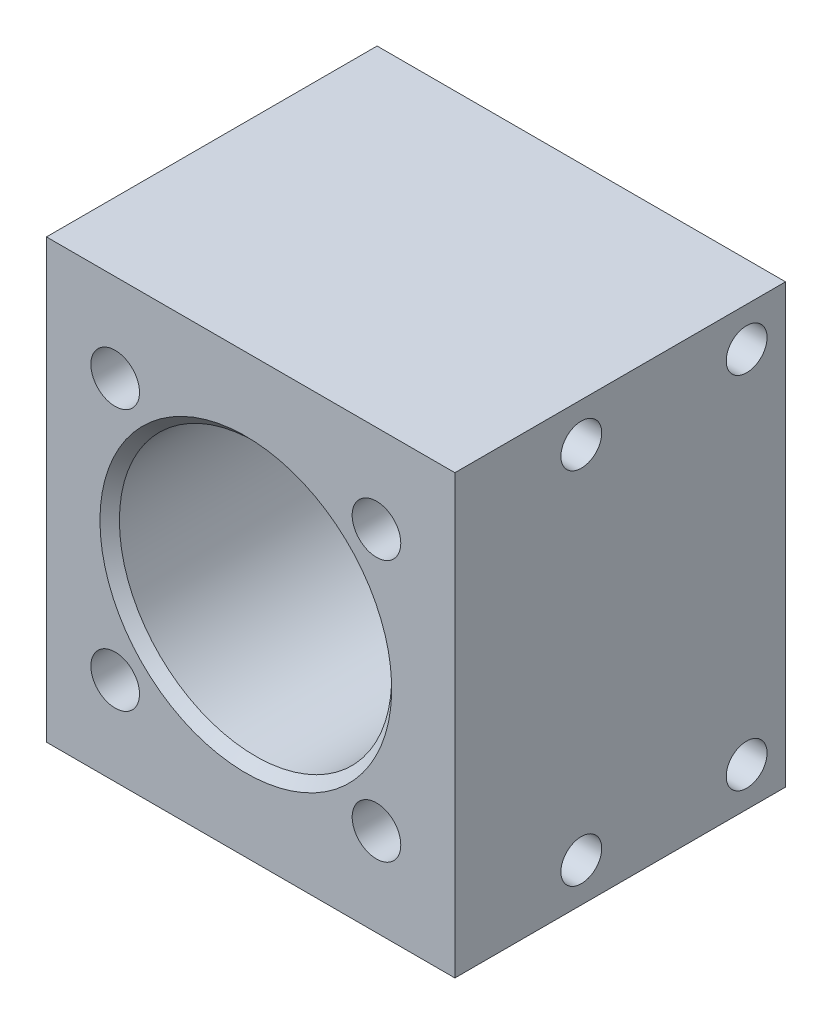
ISO-10303-21;
HEADER;
FILE_DESCRIPTION(('STEP AP214'),'2;1');
FILE_NAME('part.step','',(''),(''),'','','');
FILE_SCHEMA(('AUTOMOTIVE_DESIGN { 1 0 10303 214 1 1 1 1 }'));
ENDSEC;
DATA;
#1=APPLICATION_CONTEXT('core data for automotive mechanical design processes');
#2=APPLICATION_PROTOCOL_DEFINITION('international standard','automotive_design',2000,#1);
#3=PRODUCT_CONTEXT('',#1,'mechanical');
#4=PRODUCT('Part','Part','',(#3));
#5=PRODUCT_RELATED_PRODUCT_CATEGORY('part','',(#4));
#6=PRODUCT_DEFINITION_FORMATION('','',#4);
#7=PRODUCT_DEFINITION_CONTEXT('part definition',#1,'design');
#8=PRODUCT_DEFINITION('design','',#6,#7);
#9=PRODUCT_DEFINITION_SHAPE('','',#8);
#10=(LENGTH_UNIT() NAMED_UNIT(*) SI_UNIT(.MILLI.,.METRE.));
#11=(NAMED_UNIT(*) PLANE_ANGLE_UNIT() SI_UNIT($,.RADIAN.));
#12=(NAMED_UNIT(*) SI_UNIT($,.STERADIAN.) SOLID_ANGLE_UNIT());
#13=UNCERTAINTY_MEASURE_WITH_UNIT(LENGTH_MEASURE(1.E-05),#10,'distance_accuracy_value','');
#14=(GEOMETRIC_REPRESENTATION_CONTEXT(3) GLOBAL_UNCERTAINTY_ASSIGNED_CONTEXT((#13)) GLOBAL_UNIT_ASSIGNED_CONTEXT((#10,
#11,#12)) REPRESENTATION_CONTEXT('',''));
#15=CARTESIAN_POINT('',(0.,0.,0.));
#16=DIRECTION('',(0.,0.,1.));
#17=DIRECTION('',(1.,0.,0.));
#18=AXIS2_PLACEMENT_3D('',#15,#16,#17);
#19=CARTESIAN_POINT('',(0.,0.,34.));
#20=DIRECTION('',(0.,0.,-1.));
#21=DIRECTION('',(-1.,0.,0.));
#22=AXIS2_PLACEMENT_3D('',#19,#20,#21);
#23=PLANE('',#22);
#24=CARTESIAN_POINT('',(33.9350288425444,35.9350288425444,34.));
#25=DIRECTION('',(0.,0.,1.));
#26=DIRECTION('',(1.,0.,0.));
#27=AXIS2_PLACEMENT_3D('',#24,#25,#26);
#28=CIRCLE('',#27,2.5);
#29=CARTESIAN_POINT('',(36.4350288425444,35.9350288425444,34.));
#30=VERTEX_POINT('',#29);
#31=EDGE_CURVE('E139',#30,#30,#28,.T.);
#32=ORIENTED_EDGE('',*,*,#31,.F.);
#33=EDGE_LOOP('',(#32));
#34=FACE_BOUND('',#33,.T.);
#35=CARTESIAN_POINT('',(7.06497115745553,35.9350288425444,34.));
#36=DIRECTION('',(0.,0.,1.));
#37=DIRECTION('',(1.,0.,0.));
#38=AXIS2_PLACEMENT_3D('',#35,#36,#37);
#39=CIRCLE('',#38,2.5);
#40=CARTESIAN_POINT('',(9.56497115745553,35.9350288425444,34.));
#41=VERTEX_POINT('',#40);
#42=EDGE_CURVE('E145',#41,#41,#39,.T.);
#43=ORIENTED_EDGE('',*,*,#42,.F.);
#44=EDGE_LOOP('',(#43));
#45=FACE_BOUND('',#44,.T.);
#46=CARTESIAN_POINT('',(7.06497115745553,9.06497115745563,34.));
#47=DIRECTION('',(0.,0.,1.));
#48=DIRECTION('',(1.,0.,0.));
#49=AXIS2_PLACEMENT_3D('',#46,#47,#48);
#50=CIRCLE('',#49,2.5);
#51=CARTESIAN_POINT('',(9.56497115745553,9.06497115745563,34.));
#52=VERTEX_POINT('',#51);
#53=EDGE_CURVE('E151',#52,#52,#50,.T.);
#54=ORIENTED_EDGE('',*,*,#53,.F.);
#55=EDGE_LOOP('',(#54));
#56=FACE_BOUND('',#55,.T.);
#57=CARTESIAN_POINT('',(33.9350288425444,9.06497115745563,34.));
#58=DIRECTION('',(0.,0.,1.));
#59=DIRECTION('',(1.,0.,0.));
#60=AXIS2_PLACEMENT_3D('',#57,#58,#59);
#61=CIRCLE('',#60,2.5);
#62=CARTESIAN_POINT('',(36.4350288425444,9.06497115745563,34.));
#63=VERTEX_POINT('',#62);
#64=EDGE_CURVE('E157',#63,#63,#61,.T.);
#65=ORIENTED_EDGE('',*,*,#64,.F.);
#66=EDGE_LOOP('',(#65));
#67=FACE_BOUND('',#66,.T.);
#68=CARTESIAN_POINT('',(20.5,22.5,34.));
#69=DIRECTION('',(0.,0.,-1.));
#70=DIRECTION('',(-1.,0.,0.));
#71=AXIS2_PLACEMENT_3D('',#68,#69,#70);
#72=CIRCLE('',#71,15.);
#73=CARTESIAN_POINT('',(5.49999999999996,22.5,34.));
#74=VERTEX_POINT('',#73);
#75=EDGE_CURVE('E11',#74,#74,#72,.T.);
#76=ORIENTED_EDGE('',*,*,#75,.T.);
#77=EDGE_LOOP('',(#76));
#78=FACE_BOUND('',#77,.T.);
#79=DIRECTION('',(0.,-1.,0.));
#80=VECTOR('',#79,1.);
#81=CARTESIAN_POINT('',(0.,0.,34.));
#82=LINE('',#81,#80);
#83=CARTESIAN_POINT('',(0.,45.,34.));
#84=VERTEX_POINT('',#83);
#85=CARTESIAN_POINT('',(0.,0.,34.));
#86=VERTEX_POINT('',#85);
#87=EDGE_CURVE('E164',#84,#86,#82,.T.);
#88=ORIENTED_EDGE('',*,*,#87,.T.);
#89=DIRECTION('',(1.,0.,0.));
#90=VECTOR('',#89,1.);
#91=CARTESIAN_POINT('',(0.,0.,34.));
#92=LINE('',#91,#90);
#93=CARTESIAN_POINT('',(42.,0.,34.));
#94=VERTEX_POINT('',#93);
#95=EDGE_CURVE('E81',#86,#94,#92,.T.);
#96=ORIENTED_EDGE('',*,*,#95,.T.);
#97=DIRECTION('',(0.,1.,0.));
#98=VECTOR('',#97,1.);
#99=CARTESIAN_POINT('',(42.,0.,34.));
#100=LINE('',#99,#98);
#101=CARTESIAN_POINT('',(42.,45.,34.));
#102=VERTEX_POINT('',#101);
#103=EDGE_CURVE('E167',#94,#102,#100,.T.);
#104=ORIENTED_EDGE('',*,*,#103,.T.);
#105=DIRECTION('',(-1.,0.,0.));
#106=VECTOR('',#105,1.);
#107=CARTESIAN_POINT('',(0.,45.,34.));
#108=LINE('',#107,#106);
#109=EDGE_CURVE('E49',#102,#84,#108,.T.);
#110=ORIENTED_EDGE('',*,*,#109,.T.);
#111=EDGE_LOOP('',(#88,#96,#104,#110));
#112=FACE_BOUND('',#111,.T.);
#113=ADVANCED_FACE('F32',(#34,#45,#56,#67,#78,#112),#23,.F.);
#114=CARTESIAN_POINT('',(0.,0.,0.));
#115=DIRECTION('',(0.,0.,-1.));
#116=DIRECTION('',(-1.,0.,0.));
#117=AXIS2_PLACEMENT_3D('',#114,#115,#116);
#118=PLANE('',#117);
#119=CARTESIAN_POINT('',(20.5,22.5,0.));
#120=DIRECTION('',(0.,0.,-1.));
#121=DIRECTION('',(-1.,0.,0.));
#122=AXIS2_PLACEMENT_3D('',#119,#120,#121);
#123=CIRCLE('',#122,15.);
#124=CARTESIAN_POINT('',(5.49999999999998,22.5,0.));
#125=VERTEX_POINT('',#124);
#126=EDGE_CURVE('E184',#125,#125,#123,.F.);
#127=ORIENTED_EDGE('',*,*,#126,.T.);
#128=EDGE_LOOP('',(#127));
#129=FACE_BOUND('',#128,.T.);
#130=DIRECTION('',(0.,-1.,0.));
#131=VECTOR('',#130,1.);
#132=CARTESIAN_POINT('',(0.,0.,0.));
#133=LINE('',#132,#131);
#134=CARTESIAN_POINT('',(0.,45.,0.));
#135=VERTEX_POINT('',#134);
#136=CARTESIAN_POINT('',(0.,0.,0.));
#137=VERTEX_POINT('',#136);
#138=EDGE_CURVE('E163',#135,#137,#133,.T.);
#139=ORIENTED_EDGE('',*,*,#138,.F.);
#140=DIRECTION('',(-1.,0.,0.));
#141=VECTOR('',#140,1.);
#142=CARTESIAN_POINT('',(0.,45.,0.));
#143=LINE('',#142,#141);
#144=CARTESIAN_POINT('',(42.,45.,0.));
#145=VERTEX_POINT('',#144);
#146=EDGE_CURVE('E73',#145,#135,#143,.T.);
#147=ORIENTED_EDGE('',*,*,#146,.F.);
#148=DIRECTION('',(0.,1.,0.));
#149=VECTOR('',#148,1.);
#150=CARTESIAN_POINT('',(42.,0.,0.));
#151=LINE('',#150,#149);
#152=CARTESIAN_POINT('',(42.,0.,0.));
#153=VERTEX_POINT('',#152);
#154=EDGE_CURVE('E67',#153,#145,#151,.T.);
#155=ORIENTED_EDGE('',*,*,#154,.F.);
#156=DIRECTION('',(1.,0.,0.));
#157=VECTOR('',#156,1.);
#158=CARTESIAN_POINT('',(0.,0.,0.));
#159=LINE('',#158,#157);
#160=EDGE_CURVE('E173',#137,#153,#159,.T.);
#161=ORIENTED_EDGE('',*,*,#160,.F.);
#162=EDGE_LOOP('',(#139,#147,#155,#161));
#163=FACE_BOUND('',#162,.T.);
#164=ADVANCED_FACE('F200',(#129,#163),#118,.T.);
#165=CARTESIAN_POINT('',(0.,0.,34.));
#166=DIRECTION('',(1.,0.,0.));
#167=DIRECTION('',(0.,1.,0.));
#168=AXIS2_PLACEMENT_3D('',#165,#166,#167);
#169=PLANE('',#168);
#170=ORIENTED_EDGE('',*,*,#138,.T.);
#171=DIRECTION('',(0.,0.,-1.));
#172=VECTOR('',#171,1.);
#173=CARTESIAN_POINT('',(0.,0.,34.));
#174=LINE('',#173,#172);
#175=EDGE_CURVE('E182',#86,#137,#174,.T.);
#176=ORIENTED_EDGE('',*,*,#175,.F.);
#177=ORIENTED_EDGE('',*,*,#87,.F.);
#178=DIRECTION('',(0.,0.,-1.));
#179=VECTOR('',#178,1.);
#180=CARTESIAN_POINT('',(0.,45.,34.));
#181=LINE('',#180,#179);
#182=EDGE_CURVE('E170',#84,#135,#181,.T.);
#183=ORIENTED_EDGE('',*,*,#182,.T.);
#184=EDGE_LOOP('',(#170,#176,#177,#183));
#185=FACE_BOUND('',#184,.T.);
#186=ADVANCED_FACE('F203',(#185),#169,.F.);
#187=CARTESIAN_POINT('',(0.,0.,34.));
#188=DIRECTION('',(0.,1.,0.));
#189=DIRECTION('',(0.,0.,1.));
#190=AXIS2_PLACEMENT_3D('',#187,#188,#189);
#191=PLANE('',#190);
#192=ORIENTED_EDGE('',*,*,#160,.T.);
#193=DIRECTION('',(0.,0.,-1.));
#194=VECTOR('',#193,1.);
#195=CARTESIAN_POINT('',(42.,0.,34.));
#196=LINE('',#195,#194);
#197=EDGE_CURVE('E180',#94,#153,#196,.T.);
#198=ORIENTED_EDGE('',*,*,#197,.F.);
#199=ORIENTED_EDGE('',*,*,#95,.F.);
#200=ORIENTED_EDGE('',*,*,#175,.T.);
#201=EDGE_LOOP('',(#192,#198,#199,#200));
#202=FACE_BOUND('',#201,.T.);
#203=ADVANCED_FACE('F212',(#202),#191,.F.);
#204=CARTESIAN_POINT('',(42.,0.,34.));
#205=DIRECTION('',(-1.,0.,0.));
#206=DIRECTION('',(0.,-1.,0.));
#207=AXIS2_PLACEMENT_3D('',#204,#205,#206);
#208=PLANE('',#207);
#209=CARTESIAN_POINT('',(42.,41.,21.));
#210=DIRECTION('',(1.,0.,0.));
#211=DIRECTION('',(0.,0.,-1.));
#212=AXIS2_PLACEMENT_3D('',#209,#210,#211);
#213=CIRCLE('',#212,2.1);
#214=CARTESIAN_POINT('',(42.,41.,18.9));
#215=VERTEX_POINT('',#214);
#216=EDGE_CURVE('E117',#215,#215,#213,.T.);
#217=ORIENTED_EDGE('',*,*,#216,.F.);
#218=EDGE_LOOP('',(#217));
#219=FACE_BOUND('',#218,.T.);
#220=CARTESIAN_POINT('',(42.,41.,4.));
#221=DIRECTION('',(1.,0.,0.));
#222=DIRECTION('',(0.,0.,-1.));
#223=AXIS2_PLACEMENT_3D('',#220,#221,#222);
#224=CIRCLE('',#223,2.1);
#225=CARTESIAN_POINT('',(42.,41.,1.9));
#226=VERTEX_POINT('',#225);
#227=EDGE_CURVE('E116',#226,#226,#224,.T.);
#228=ORIENTED_EDGE('',*,*,#227,.F.);
#229=EDGE_LOOP('',(#228));
#230=FACE_BOUND('',#229,.T.);
#231=CARTESIAN_POINT('',(42.,3.99999999999999,4.));
#232=DIRECTION('',(1.,0.,0.));
#233=DIRECTION('',(0.,0.,-1.));
#234=AXIS2_PLACEMENT_3D('',#231,#232,#233);
#235=CIRCLE('',#234,2.1);
#236=CARTESIAN_POINT('',(42.,3.99999999999999,1.9));
#237=VERTEX_POINT('',#236);
#238=EDGE_CURVE('E127',#237,#237,#235,.T.);
#239=ORIENTED_EDGE('',*,*,#238,.F.);
#240=EDGE_LOOP('',(#239));
#241=FACE_BOUND('',#240,.T.);
#242=CARTESIAN_POINT('',(42.,4.,21.));
#243=DIRECTION('',(1.,0.,0.));
#244=DIRECTION('',(0.,0.,-1.));
#245=AXIS2_PLACEMENT_3D('',#242,#243,#244);
#246=CIRCLE('',#245,2.1);
#247=CARTESIAN_POINT('',(42.,4.,18.9));
#248=VERTEX_POINT('',#247);
#249=EDGE_CURVE('E133',#248,#248,#246,.T.);
#250=ORIENTED_EDGE('',*,*,#249,.F.);
#251=EDGE_LOOP('',(#250));
#252=FACE_BOUND('',#251,.T.);
#253=ORIENTED_EDGE('',*,*,#154,.T.);
#254=DIRECTION('',(0.,0.,-1.));
#255=VECTOR('',#254,1.);
#256=CARTESIAN_POINT('',(42.,45.,34.));
#257=LINE('',#256,#255);
#258=EDGE_CURVE('E178',#102,#145,#257,.T.);
#259=ORIENTED_EDGE('',*,*,#258,.F.);
#260=ORIENTED_EDGE('',*,*,#103,.F.);
#261=ORIENTED_EDGE('',*,*,#197,.T.);
#262=EDGE_LOOP('',(#253,#259,#260,#261));
#263=FACE_BOUND('',#262,.T.);
#264=ADVANCED_FACE('F211',(#219,#230,#241,#252,#263),#208,.F.);
#265=CARTESIAN_POINT('',(0.,45.,34.));
#266=DIRECTION('',(0.,-1.,0.));
#267=DIRECTION('',(1.,0.,0.));
#268=AXIS2_PLACEMENT_3D('',#265,#266,#267);
#269=PLANE('',#268);
#270=ORIENTED_EDGE('',*,*,#146,.T.);
#271=ORIENTED_EDGE('',*,*,#182,.F.);
#272=ORIENTED_EDGE('',*,*,#109,.F.);
#273=ORIENTED_EDGE('',*,*,#258,.T.);
#274=EDGE_LOOP('',(#270,#271,#272,#273));
#275=FACE_BOUND('',#274,.T.);
#276=ADVANCED_FACE('F209',(#275),#269,.F.);
#277=CARTESIAN_POINT('',(20.5,22.5,34.));
#278=DIRECTION('',(0.,0.,-1.));
#279=DIRECTION('',(-1.,0.,0.));
#280=AXIS2_PLACEMENT_3D('',#277,#278,#279);
#281=CYLINDRICAL_SURFACE('',#280,14.);
#282=CARTESIAN_POINT('',(20.5,22.5,0.999999999999994));
#283=DIRECTION('',(0.,0.,-1.));
#284=DIRECTION('',(-1.,0.,0.));
#285=AXIS2_PLACEMENT_3D('',#282,#283,#284);
#286=CIRCLE('',#285,14.);
#287=CARTESIAN_POINT('',(6.49999999999998,22.5,0.999999999999994));
#288=VERTEX_POINT('',#287);
#289=EDGE_CURVE('E41',#288,#288,#286,.T.);
#290=ORIENTED_EDGE('',*,*,#289,.T.);
#291=EDGE_LOOP('',(#290));
#292=FACE_BOUND('',#291,.T.);
#293=CARTESIAN_POINT('',(20.5,22.5,33.));
#294=DIRECTION('',(0.,0.,-1.));
#295=DIRECTION('',(-1.,0.,0.));
#296=AXIS2_PLACEMENT_3D('',#293,#294,#295);
#297=CIRCLE('',#296,14.);
#298=CARTESIAN_POINT('',(6.49999999999998,22.5,33.));
#299=VERTEX_POINT('',#298);
#300=EDGE_CURVE('E187',#299,#299,#297,.F.);
#301=ORIENTED_EDGE('',*,*,#300,.T.);
#302=EDGE_LOOP('',(#301));
#303=FACE_BOUND('',#302,.T.);
#304=ADVANCED_FACE('F192',(#292,#303),#281,.F.);
#305=CARTESIAN_POINT('',(20.5,22.5,0.));
#306=DIRECTION('',(0.,0.,-1.));
#307=DIRECTION('',(-1.,0.,0.));
#308=AXIS2_PLACEMENT_3D('',#305,#306,#307);
#309=CONICAL_SURFACE('',#308,15.,0.785398163397449);
#310=ORIENTED_EDGE('',*,*,#289,.F.);
#311=EDGE_LOOP('',(#310));
#312=FACE_BOUND('',#311,.T.);
#313=ORIENTED_EDGE('',*,*,#126,.F.);
#314=EDGE_LOOP('',(#313));
#315=FACE_BOUND('',#314,.T.);
#316=ADVANCED_FACE('F195',(#312,#315),#309,.F.);
#317=CARTESIAN_POINT('',(20.5,22.5,33.));
#318=DIRECTION('',(0.,0.,1.));
#319=DIRECTION('',(1.,0.,0.));
#320=AXIS2_PLACEMENT_3D('',#317,#318,#319);
#321=CONICAL_SURFACE('',#320,14.,0.78539816339746);
#322=ORIENTED_EDGE('',*,*,#75,.F.);
#323=EDGE_LOOP('',(#322));
#324=FACE_BOUND('',#323,.T.);
#325=ORIENTED_EDGE('',*,*,#300,.F.);
#326=EDGE_LOOP('',(#325));
#327=FACE_BOUND('',#326,.T.);
#328=ADVANCED_FACE('F34',(#324,#327),#321,.F.);
#329=CARTESIAN_POINT('',(33.9350288425444,9.06497115745563,17.));
#330=DIRECTION('',(0.,0.,1.));
#331=DIRECTION('',(1.,0.,0.));
#332=AXIS2_PLACEMENT_3D('',#329,#330,#331);
#333=CONICAL_SURFACE('',#332,2.5,1.02974425867665);
#334=CARTESIAN_POINT('',(33.9350288425444,9.06497115745563,15.4978484524311));
#335=VERTEX_POINT('',#334);
#336=VERTEX_LOOP('',#335);
#337=FACE_BOUND('',#336,.T.);
#338=CARTESIAN_POINT('',(33.9350288425444,9.06497115745563,17.));
#339=DIRECTION('',(0.,0.,1.));
#340=DIRECTION('',(1.,0.,0.));
#341=AXIS2_PLACEMENT_3D('',#338,#339,#340);
#342=CIRCLE('',#341,2.5);
#343=CARTESIAN_POINT('',(36.4350288425444,9.06497115745563,17.));
#344=VERTEX_POINT('',#343);
#345=EDGE_CURVE('E160',#344,#344,#342,.T.);
#346=ORIENTED_EDGE('',*,*,#345,.T.);
#347=EDGE_LOOP('',(#346));
#348=FACE_BOUND('',#347,.T.);
#349=ADVANCED_FACE('F249',(#337,#348),#333,.F.);
#350=CARTESIAN_POINT('',(33.9350288425444,9.06497115745563,34.));
#351=DIRECTION('',(0.,0.,1.));
#352=DIRECTION('',(1.,0.,0.));
#353=AXIS2_PLACEMENT_3D('',#350,#351,#352);
#354=CYLINDRICAL_SURFACE('',#353,2.5);
#355=ORIENTED_EDGE('',*,*,#345,.F.);
#356=EDGE_LOOP('',(#355));
#357=FACE_BOUND('',#356,.T.);
#358=ORIENTED_EDGE('',*,*,#64,.T.);
#359=EDGE_LOOP('',(#358));
#360=FACE_BOUND('',#359,.T.);
#361=ADVANCED_FACE('F256',(#357,#360),#354,.F.);
#362=CARTESIAN_POINT('',(7.06497115745553,9.06497115745563,17.));
#363=DIRECTION('',(0.,0.,1.));
#364=DIRECTION('',(1.,0.,0.));
#365=AXIS2_PLACEMENT_3D('',#362,#363,#364);
#366=CONICAL_SURFACE('',#365,2.5,1.02974425867665);
#367=CARTESIAN_POINT('',(7.06497115745553,9.06497115745563,15.4978484524311));
#368=VERTEX_POINT('',#367);
#369=VERTEX_LOOP('',#368);
#370=FACE_BOUND('',#369,.T.);
#371=CARTESIAN_POINT('',(7.06497115745553,9.06497115745563,17.));
#372=DIRECTION('',(0.,0.,1.));
#373=DIRECTION('',(1.,0.,0.));
#374=AXIS2_PLACEMENT_3D('',#371,#372,#373);
#375=CIRCLE('',#374,2.5);
#376=CARTESIAN_POINT('',(9.56497115745553,9.06497115745563,17.));
#377=VERTEX_POINT('',#376);
#378=EDGE_CURVE('E154',#377,#377,#375,.T.);
#379=ORIENTED_EDGE('',*,*,#378,.T.);
#380=EDGE_LOOP('',(#379));
#381=FACE_BOUND('',#380,.T.);
#382=ADVANCED_FACE('F263',(#370,#381),#366,.F.);
#383=CARTESIAN_POINT('',(7.06497115745553,9.06497115745563,34.));
#384=DIRECTION('',(0.,0.,1.));
#385=DIRECTION('',(1.,0.,0.));
#386=AXIS2_PLACEMENT_3D('',#383,#384,#385);
#387=CYLINDRICAL_SURFACE('',#386,2.5);
#388=ORIENTED_EDGE('',*,*,#378,.F.);
#389=EDGE_LOOP('',(#388));
#390=FACE_BOUND('',#389,.T.);
#391=ORIENTED_EDGE('',*,*,#53,.T.);
#392=EDGE_LOOP('',(#391));
#393=FACE_BOUND('',#392,.T.);
#394=ADVANCED_FACE('F271',(#390,#393),#387,.F.);
#395=CARTESIAN_POINT('',(7.06497115745553,35.9350288425444,17.));
#396=DIRECTION('',(0.,0.,1.));
#397=DIRECTION('',(1.,0.,0.));
#398=AXIS2_PLACEMENT_3D('',#395,#396,#397);
#399=CONICAL_SURFACE('',#398,2.5,1.02974425867665);
#400=CARTESIAN_POINT('',(7.06497115745553,35.9350288425444,15.4978484524311));
#401=VERTEX_POINT('',#400);
#402=VERTEX_LOOP('',#401);
#403=FACE_BOUND('',#402,.T.);
#404=CARTESIAN_POINT('',(7.06497115745553,35.9350288425444,17.));
#405=DIRECTION('',(0.,0.,1.));
#406=DIRECTION('',(1.,0.,0.));
#407=AXIS2_PLACEMENT_3D('',#404,#405,#406);
#408=CIRCLE('',#407,2.5);
#409=CARTESIAN_POINT('',(9.56497115745553,35.9350288425444,17.));
#410=VERTEX_POINT('',#409);
#411=EDGE_CURVE('E148',#410,#410,#408,.T.);
#412=ORIENTED_EDGE('',*,*,#411,.T.);
#413=EDGE_LOOP('',(#412));
#414=FACE_BOUND('',#413,.T.);
#415=ADVANCED_FACE('F279',(#403,#414),#399,.F.);
#416=CARTESIAN_POINT('',(7.06497115745553,35.9350288425444,34.));
#417=DIRECTION('',(0.,0.,1.));
#418=DIRECTION('',(1.,0.,0.));
#419=AXIS2_PLACEMENT_3D('',#416,#417,#418);
#420=CYLINDRICAL_SURFACE('',#419,2.5);
#421=ORIENTED_EDGE('',*,*,#411,.F.);
#422=EDGE_LOOP('',(#421));
#423=FACE_BOUND('',#422,.T.);
#424=ORIENTED_EDGE('',*,*,#42,.T.);
#425=EDGE_LOOP('',(#424));
#426=FACE_BOUND('',#425,.T.);
#427=ADVANCED_FACE('F287',(#423,#426),#420,.F.);
#428=CARTESIAN_POINT('',(33.9350288425444,35.9350288425444,17.));
#429=DIRECTION('',(0.,0.,1.));
#430=DIRECTION('',(1.,0.,0.));
#431=AXIS2_PLACEMENT_3D('',#428,#429,#430);
#432=CONICAL_SURFACE('',#431,2.5,1.02974425867665);
#433=CARTESIAN_POINT('',(33.9350288425444,35.9350288425444,15.4978484524311));
#434=VERTEX_POINT('',#433);
#435=VERTEX_LOOP('',#434);
#436=FACE_BOUND('',#435,.T.);
#437=CARTESIAN_POINT('',(33.9350288425444,35.9350288425444,17.));
#438=DIRECTION('',(0.,0.,1.));
#439=DIRECTION('',(1.,0.,0.));
#440=AXIS2_PLACEMENT_3D('',#437,#438,#439);
#441=CIRCLE('',#440,2.5);
#442=CARTESIAN_POINT('',(36.4350288425444,35.9350288425444,17.));
#443=VERTEX_POINT('',#442);
#444=EDGE_CURVE('E142',#443,#443,#441,.T.);
#445=ORIENTED_EDGE('',*,*,#444,.T.);
#446=EDGE_LOOP('',(#445));
#447=FACE_BOUND('',#446,.T.);
#448=ADVANCED_FACE('F295',(#436,#447),#432,.F.);
#449=CARTESIAN_POINT('',(33.9350288425444,35.9350288425444,34.));
#450=DIRECTION('',(0.,0.,1.));
#451=DIRECTION('',(1.,0.,0.));
#452=AXIS2_PLACEMENT_3D('',#449,#450,#451);
#453=CYLINDRICAL_SURFACE('',#452,2.5);
#454=ORIENTED_EDGE('',*,*,#444,.F.);
#455=EDGE_LOOP('',(#454));
#456=FACE_BOUND('',#455,.T.);
#457=ORIENTED_EDGE('',*,*,#31,.T.);
#458=EDGE_LOOP('',(#457));
#459=FACE_BOUND('',#458,.T.);
#460=ADVANCED_FACE('F303',(#456,#459),#453,.F.);
#461=CARTESIAN_POINT('',(17.,4.,21.));
#462=DIRECTION('',(1.,0.,0.));
#463=DIRECTION('',(0.,0.,-1.));
#464=AXIS2_PLACEMENT_3D('',#461,#462,#463);
#465=CONICAL_SURFACE('',#464,2.1,1.02974425867665);
#466=CARTESIAN_POINT('',(15.7381927000421,3.99999999999999,21.));
#467=VERTEX_POINT('',#466);
#468=VERTEX_LOOP('',#467);
#469=FACE_BOUND('',#468,.T.);
#470=CARTESIAN_POINT('',(17.,4.,21.));
#471=DIRECTION('',(1.,0.,0.));
#472=DIRECTION('',(0.,0.,-1.));
#473=AXIS2_PLACEMENT_3D('',#470,#471,#472);
#474=CIRCLE('',#473,2.1);
#475=CARTESIAN_POINT('',(17.,4.,18.9));
#476=VERTEX_POINT('',#475);
#477=EDGE_CURVE('E136',#476,#476,#474,.T.);
#478=ORIENTED_EDGE('',*,*,#477,.T.);
#479=EDGE_LOOP('',(#478));
#480=FACE_BOUND('',#479,.T.);
#481=ADVANCED_FACE('F311',(#469,#480),#465,.F.);
#482=CARTESIAN_POINT('',(42.,4.,21.));
#483=DIRECTION('',(1.,0.,0.));
#484=DIRECTION('',(0.,0.,-1.));
#485=AXIS2_PLACEMENT_3D('',#482,#483,#484);
#486=CYLINDRICAL_SURFACE('',#485,2.1);
#487=ORIENTED_EDGE('',*,*,#477,.F.);
#488=EDGE_LOOP('',(#487));
#489=FACE_BOUND('',#488,.T.);
#490=ORIENTED_EDGE('',*,*,#249,.T.);
#491=EDGE_LOOP('',(#490));
#492=FACE_BOUND('',#491,.T.);
#493=ADVANCED_FACE('F320',(#489,#492),#486,.F.);
#494=CARTESIAN_POINT('',(17.,3.99999999999999,4.));
#495=DIRECTION('',(1.,0.,0.));
#496=DIRECTION('',(0.,0.,-1.));
#497=AXIS2_PLACEMENT_3D('',#494,#495,#496);
#498=CONICAL_SURFACE('',#497,2.1,1.02974425867665);
#499=CARTESIAN_POINT('',(15.7381927000421,3.99999999999999,4.));
#500=VERTEX_POINT('',#499);
#501=VERTEX_LOOP('',#500);
#502=FACE_BOUND('',#501,.T.);
#503=CARTESIAN_POINT('',(17.,3.99999999999999,4.));
#504=DIRECTION('',(1.,0.,0.));
#505=DIRECTION('',(0.,0.,-1.));
#506=AXIS2_PLACEMENT_3D('',#503,#504,#505);
#507=CIRCLE('',#506,2.1);
#508=CARTESIAN_POINT('',(17.,3.99999999999999,1.90000000000001));
#509=VERTEX_POINT('',#508);
#510=EDGE_CURVE('E130',#509,#509,#507,.T.);
#511=ORIENTED_EDGE('',*,*,#510,.T.);
#512=EDGE_LOOP('',(#511));
#513=FACE_BOUND('',#512,.T.);
#514=ADVANCED_FACE('F328',(#502,#513),#498,.F.);
#515=CARTESIAN_POINT('',(42.,3.99999999999999,4.));
#516=DIRECTION('',(1.,0.,0.));
#517=DIRECTION('',(0.,0.,-1.));
#518=AXIS2_PLACEMENT_3D('',#515,#516,#517);
#519=CYLINDRICAL_SURFACE('',#518,2.1);
#520=ORIENTED_EDGE('',*,*,#510,.F.);
#521=EDGE_LOOP('',(#520));
#522=FACE_BOUND('',#521,.T.);
#523=ORIENTED_EDGE('',*,*,#238,.T.);
#524=EDGE_LOOP('',(#523));
#525=FACE_BOUND('',#524,.T.);
#526=ADVANCED_FACE('F336',(#522,#525),#519,.F.);
#527=CARTESIAN_POINT('',(17.,41.,4.));
#528=DIRECTION('',(1.,0.,0.));
#529=DIRECTION('',(0.,0.,-1.));
#530=AXIS2_PLACEMENT_3D('',#527,#528,#529);
#531=CONICAL_SURFACE('',#530,2.1,1.02974425867665);
#532=CARTESIAN_POINT('',(15.7381927000421,41.,4.));
#533=VERTEX_POINT('',#532);
#534=VERTEX_LOOP('',#533);
#535=FACE_BOUND('',#534,.T.);
#536=CARTESIAN_POINT('',(17.,41.,4.));
#537=DIRECTION('',(1.,0.,0.));
#538=DIRECTION('',(0.,0.,-1.));
#539=AXIS2_PLACEMENT_3D('',#536,#537,#538);
#540=CIRCLE('',#539,2.1);
#541=CARTESIAN_POINT('',(17.,41.,1.9));
#542=VERTEX_POINT('',#541);
#543=EDGE_CURVE('E120',#542,#542,#540,.T.);
#544=ORIENTED_EDGE('',*,*,#543,.T.);
#545=EDGE_LOOP('',(#544));
#546=FACE_BOUND('',#545,.T.);
#547=ADVANCED_FACE('F344',(#535,#546),#531,.F.);
#548=CARTESIAN_POINT('',(42.,41.,4.));
#549=DIRECTION('',(1.,0.,0.));
#550=DIRECTION('',(0.,0.,-1.));
#551=AXIS2_PLACEMENT_3D('',#548,#549,#550);
#552=CYLINDRICAL_SURFACE('',#551,2.1);
#553=ORIENTED_EDGE('',*,*,#543,.F.);
#554=EDGE_LOOP('',(#553));
#555=FACE_BOUND('',#554,.T.);
#556=ORIENTED_EDGE('',*,*,#227,.T.);
#557=EDGE_LOOP('',(#556));
#558=FACE_BOUND('',#557,.T.);
#559=ADVANCED_FACE('F110',(#555,#558),#552,.F.);
#560=CARTESIAN_POINT('',(17.,41.,21.));
#561=DIRECTION('',(1.,0.,0.));
#562=DIRECTION('',(0.,0.,-1.));
#563=AXIS2_PLACEMENT_3D('',#560,#561,#562);
#564=CONICAL_SURFACE('',#563,2.1,1.02974425867665);
#565=CARTESIAN_POINT('',(15.7381927000421,41.,21.));
#566=VERTEX_POINT('',#565);
#567=VERTEX_LOOP('',#566);
#568=FACE_BOUND('',#567,.T.);
#569=CARTESIAN_POINT('',(17.,41.,21.));
#570=DIRECTION('',(1.,0.,0.));
#571=DIRECTION('',(0.,0.,-1.));
#572=AXIS2_PLACEMENT_3D('',#569,#570,#571);
#573=CIRCLE('',#572,2.1);
#574=CARTESIAN_POINT('',(17.,41.,18.9));
#575=VERTEX_POINT('',#574);
#576=EDGE_CURVE('E114',#575,#575,#573,.T.);
#577=ORIENTED_EDGE('',*,*,#576,.T.);
#578=EDGE_LOOP('',(#577));
#579=FACE_BOUND('',#578,.T.);
#580=ADVANCED_FACE('F106',(#568,#579),#564,.F.);
#581=CARTESIAN_POINT('',(42.,41.,21.));
#582=DIRECTION('',(1.,0.,0.));
#583=DIRECTION('',(0.,0.,-1.));
#584=AXIS2_PLACEMENT_3D('',#581,#582,#583);
#585=CYLINDRICAL_SURFACE('',#584,2.1);
#586=ORIENTED_EDGE('',*,*,#576,.F.);
#587=EDGE_LOOP('',(#586));
#588=FACE_BOUND('',#587,.T.);
#589=ORIENTED_EDGE('',*,*,#216,.T.);
#590=EDGE_LOOP('',(#589));
#591=FACE_BOUND('',#590,.T.);
#592=ADVANCED_FACE('F109',(#588,#591),#585,.F.);
#593=CLOSED_SHELL('',(#113,#164,#186,#203,#264,#276,#304,#316,#328,#349,#361,#382,#394,#415,
#427,#448,#460,#481,#493,#514,#526,#547,#559,#580,#592));
#594=MANIFOLD_SOLID_BREP('B2',#593);
#595=ADVANCED_BREP_SHAPE_REPRESENTATION('',(#18,#594),#14);
#596=SHAPE_DEFINITION_REPRESENTATION(#9,#595);
ENDSEC;
END-ISO-10303-21;
